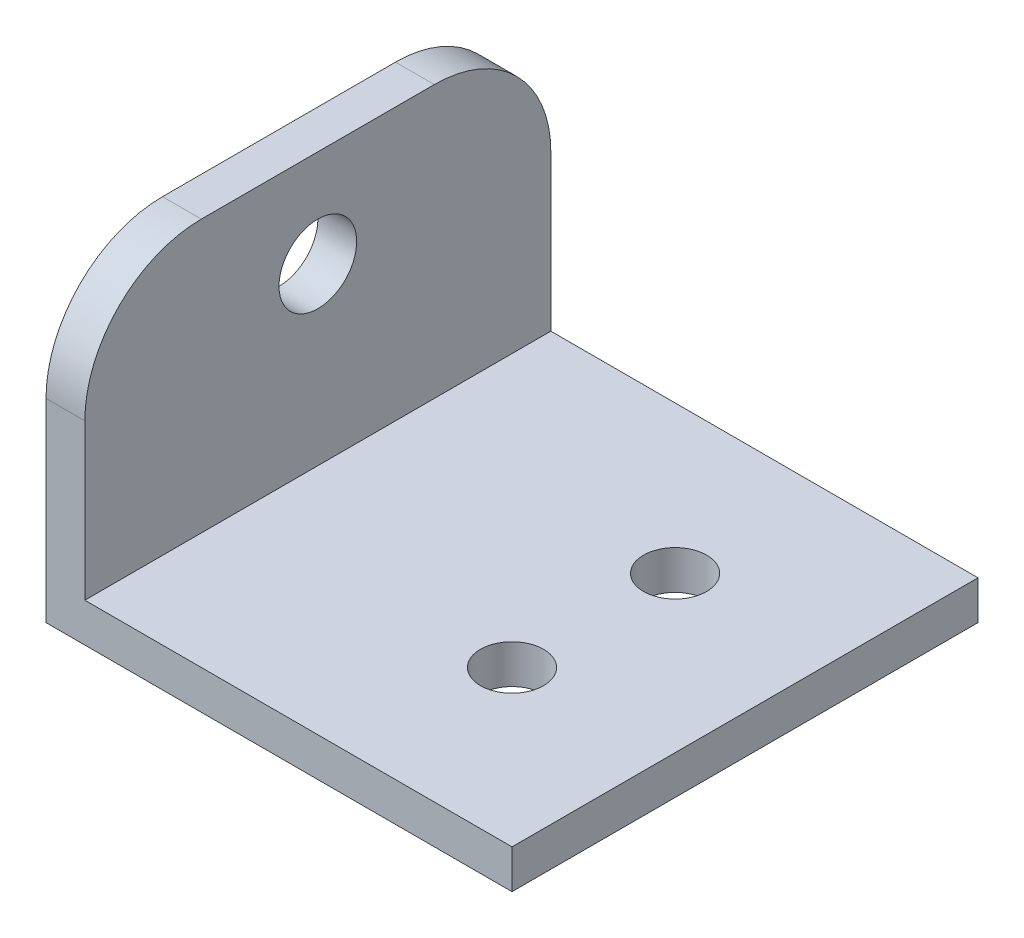
ISO-10303-21;
HEADER;
FILE_DESCRIPTION(('STEP AP214'),'2;1');
FILE_NAME('part.step','',(''),(''),'','','');
FILE_SCHEMA(('AUTOMOTIVE_DESIGN { 1 0 10303 214 1 1 1 1 }'));
ENDSEC;
DATA;
#1=APPLICATION_CONTEXT('core data for automotive mechanical design processes');
#2=APPLICATION_PROTOCOL_DEFINITION('international standard','automotive_design',2000,#1);
#3=PRODUCT_CONTEXT('',#1,'mechanical');
#4=PRODUCT('Part','Part','',(#3));
#5=PRODUCT_RELATED_PRODUCT_CATEGORY('part','',(#4));
#6=PRODUCT_DEFINITION_FORMATION('','',#4);
#7=PRODUCT_DEFINITION_CONTEXT('part definition',#1,'design');
#8=PRODUCT_DEFINITION('design','',#6,#7);
#9=PRODUCT_DEFINITION_SHAPE('','',#8);
#10=(LENGTH_UNIT() NAMED_UNIT(*) SI_UNIT(.MILLI.,.METRE.));
#11=(NAMED_UNIT(*) PLANE_ANGLE_UNIT() SI_UNIT($,.RADIAN.));
#12=(NAMED_UNIT(*) SI_UNIT($,.STERADIAN.) SOLID_ANGLE_UNIT());
#13=UNCERTAINTY_MEASURE_WITH_UNIT(LENGTH_MEASURE(1.E-05),#10,'distance_accuracy_value','');
#14=(GEOMETRIC_REPRESENTATION_CONTEXT(3) GLOBAL_UNCERTAINTY_ASSIGNED_CONTEXT((#13)) GLOBAL_UNIT_ASSIGNED_CONTEXT((#10,
#11,#12)) REPRESENTATION_CONTEXT('',''));
#15=CARTESIAN_POINT('',(0.,0.,0.));
#16=DIRECTION('',(0.,0.,1.));
#17=DIRECTION('',(1.,0.,0.));
#18=AXIS2_PLACEMENT_3D('',#15,#16,#17);
#19=CARTESIAN_POINT('',(0.,0.,38.1));
#20=DIRECTION('',(0.,1.,0.));
#21=DIRECTION('',(0.,0.,1.));
#22=AXIS2_PLACEMENT_3D('',#19,#20,#21);
#23=PLANE('',#22);
#24=CARTESIAN_POINT('',(25.4,0.,25.4));
#25=DIRECTION('',(0.,-1.,0.));
#26=DIRECTION('',(0.,0.,-1.));
#27=AXIS2_PLACEMENT_3D('',#24,#25,#26);
#28=CIRCLE('',#27,2.57968749999999);
#29=CARTESIAN_POINT('',(25.4,0.,22.8203125));
#30=VERTEX_POINT('',#29);
#31=EDGE_CURVE('E189',#30,#30,#28,.T.);
#32=ORIENTED_EDGE('',*,*,#31,.F.);
#33=EDGE_LOOP('',(#32));
#34=FACE_BOUND('',#33,.T.);
#35=CARTESIAN_POINT('',(25.4,0.,12.065));
#36=DIRECTION('',(0.,-1.,0.));
#37=DIRECTION('',(0.,0.,-1.));
#38=AXIS2_PLACEMENT_3D('',#35,#36,#37);
#39=CIRCLE('',#38,2.57968749999999);
#40=CARTESIAN_POINT('',(25.4,0.,9.48531250000001));
#41=VERTEX_POINT('',#40);
#42=EDGE_CURVE('E183',#41,#41,#39,.T.);
#43=ORIENTED_EDGE('',*,*,#42,.F.);
#44=EDGE_LOOP('',(#43));
#45=FACE_BOUND('',#44,.T.);
#46=DIRECTION('',(1.,0.,0.));
#47=VECTOR('',#46,1.);
#48=CARTESIAN_POINT('',(0.,0.,0.));
#49=LINE('',#48,#47);
#50=CARTESIAN_POINT('',(0.,0.,0.));
#51=VERTEX_POINT('',#50);
#52=CARTESIAN_POINT('',(38.1,0.,0.));
#53=VERTEX_POINT('',#52);
#54=EDGE_CURVE('E127',#51,#53,#49,.T.);
#55=ORIENTED_EDGE('',*,*,#54,.T.);
#56=DIRECTION('',(0.,0.,-1.));
#57=VECTOR('',#56,1.);
#58=CARTESIAN_POINT('',(38.1,0.,38.1));
#59=LINE('',#58,#57);
#60=CARTESIAN_POINT('',(38.1,0.,38.1));
#61=VERTEX_POINT('',#60);
#62=EDGE_CURVE('E108',#61,#53,#59,.T.);
#63=ORIENTED_EDGE('',*,*,#62,.F.);
#64=DIRECTION('',(1.,0.,0.));
#65=VECTOR('',#64,1.);
#66=CARTESIAN_POINT('',(0.,0.,38.1));
#67=LINE('',#66,#65);
#68=CARTESIAN_POINT('',(0.,0.,38.1));
#69=VERTEX_POINT('',#68);
#70=EDGE_CURVE('E115',#69,#61,#67,.T.);
#71=ORIENTED_EDGE('',*,*,#70,.F.);
#72=DIRECTION('',(0.,0.,-1.));
#73=VECTOR('',#72,1.);
#74=CARTESIAN_POINT('',(0.,0.,38.1));
#75=LINE('',#74,#73);
#76=EDGE_CURVE('E167',#69,#51,#75,.T.);
#77=ORIENTED_EDGE('',*,*,#76,.T.);
#78=EDGE_LOOP('',(#55,#63,#71,#77));
#79=FACE_BOUND('',#78,.T.);
#80=ADVANCED_FACE('F35',(#34,#45,#79),#23,.F.);
#81=CARTESIAN_POINT('',(38.1,0.,38.1));
#82=DIRECTION('',(-1.,0.,0.));
#83=DIRECTION('',(0.,0.,1.));
#84=AXIS2_PLACEMENT_3D('',#81,#82,#83);
#85=PLANE('',#84);
#86=DIRECTION('',(0.,1.,0.));
#87=VECTOR('',#86,1.);
#88=CARTESIAN_POINT('',(38.1,0.,0.));
#89=LINE('',#88,#87);
#90=CARTESIAN_POINT('',(38.1,3.175,0.));
#91=VERTEX_POINT('',#90);
#92=EDGE_CURVE('E173',#53,#91,#89,.T.);
#93=ORIENTED_EDGE('',*,*,#92,.T.);
#94=DIRECTION('',(0.,0.,-1.));
#95=VECTOR('',#94,1.);
#96=CARTESIAN_POINT('',(38.1,3.175,38.1));
#97=LINE('',#96,#95);
#98=CARTESIAN_POINT('',(38.1,3.175,38.1));
#99=VERTEX_POINT('',#98);
#100=EDGE_CURVE('E111',#99,#91,#97,.T.);
#101=ORIENTED_EDGE('',*,*,#100,.F.);
#102=DIRECTION('',(0.,1.,0.));
#103=VECTOR('',#102,1.);
#104=CARTESIAN_POINT('',(38.1,0.,38.1));
#105=LINE('',#104,#103);
#106=EDGE_CURVE('E104',#61,#99,#105,.T.);
#107=ORIENTED_EDGE('',*,*,#106,.F.);
#108=ORIENTED_EDGE('',*,*,#62,.T.);
#109=EDGE_LOOP('',(#93,#101,#107,#108));
#110=FACE_BOUND('',#109,.T.);
#111=ADVANCED_FACE('F106',(#110),#85,.F.);
#112=CARTESIAN_POINT('',(3.175,3.175,38.1));
#113=DIRECTION('',(0.,-1.,0.));
#114=DIRECTION('',(0.,0.,-1.));
#115=AXIS2_PLACEMENT_3D('',#112,#113,#114);
#116=PLANE('',#115);
#117=CARTESIAN_POINT('',(25.4,3.175,25.4));
#118=DIRECTION('',(0.,-1.,0.));
#119=DIRECTION('',(0.,0.,-1.));
#120=AXIS2_PLACEMENT_3D('',#117,#118,#119);
#121=CIRCLE('',#120,2.57968749999999);
#122=CARTESIAN_POINT('',(25.4,3.175,22.8203125));
#123=VERTEX_POINT('',#122);
#124=EDGE_CURVE('E186',#123,#123,#121,.T.);
#125=ORIENTED_EDGE('',*,*,#124,.T.);
#126=EDGE_LOOP('',(#125));
#127=FACE_BOUND('',#126,.T.);
#128=CARTESIAN_POINT('',(25.4,3.175,12.065));
#129=DIRECTION('',(0.,-1.,0.));
#130=DIRECTION('',(0.,0.,-1.));
#131=AXIS2_PLACEMENT_3D('',#128,#129,#130);
#132=CIRCLE('',#131,2.57968749999999);
#133=CARTESIAN_POINT('',(25.4,3.175,9.48531250000001));
#134=VERTEX_POINT('',#133);
#135=EDGE_CURVE('E177',#134,#134,#132,.T.);
#136=ORIENTED_EDGE('',*,*,#135,.T.);
#137=EDGE_LOOP('',(#136));
#138=FACE_BOUND('',#137,.T.);
#139=DIRECTION('',(-1.,0.,0.));
#140=VECTOR('',#139,1.);
#141=CARTESIAN_POINT('',(3.175,3.175,0.));
#142=LINE('',#141,#140);
#143=CARTESIAN_POINT('',(3.175,3.175,0.));
#144=VERTEX_POINT('',#143);
#145=EDGE_CURVE('E163',#91,#144,#142,.T.);
#146=ORIENTED_EDGE('',*,*,#145,.T.);
#147=DIRECTION('',(0.,0.,-1.));
#148=VECTOR('',#147,1.);
#149=CARTESIAN_POINT('',(3.175,3.175,38.1));
#150=LINE('',#149,#148);
#151=CARTESIAN_POINT('',(3.175,3.175,38.1));
#152=VERTEX_POINT('',#151);
#153=EDGE_CURVE('E132',#152,#144,#150,.T.);
#154=ORIENTED_EDGE('',*,*,#153,.F.);
#155=DIRECTION('',(-1.,0.,0.));
#156=VECTOR('',#155,1.);
#157=CARTESIAN_POINT('',(3.175,3.175,38.1));
#158=LINE('',#157,#156);
#159=EDGE_CURVE('E114',#99,#152,#158,.T.);
#160=ORIENTED_EDGE('',*,*,#159,.F.);
#161=ORIENTED_EDGE('',*,*,#100,.T.);
#162=EDGE_LOOP('',(#146,#154,#160,#161));
#163=FACE_BOUND('',#162,.T.);
#164=ADVANCED_FACE('F217',(#127,#138,#163),#116,.F.);
#165=CARTESIAN_POINT('',(3.175,3.175,38.1));
#166=DIRECTION('',(-1.,0.,0.));
#167=DIRECTION('',(0.,0.,1.));
#168=AXIS2_PLACEMENT_3D('',#165,#166,#167);
#169=PLANE('',#168);
#170=CARTESIAN_POINT('',(3.175,17.4625,19.05));
#171=DIRECTION('',(-1.,0.,0.));
#172=DIRECTION('',(0.,0.,1.));
#173=AXIS2_PLACEMENT_3D('',#170,#171,#172);
#174=CIRCLE('',#173,3.17499999999999);
#175=CARTESIAN_POINT('',(3.175,17.4625,22.225));
#176=VERTEX_POINT('',#175);
#177=EDGE_CURVE('E192',#176,#176,#174,.T.);
#178=ORIENTED_EDGE('',*,*,#177,.T.);
#179=EDGE_LOOP('',(#178));
#180=FACE_BOUND('',#179,.T.);
#181=DIRECTION('',(0.,1.,0.));
#182=VECTOR('',#181,1.);
#183=CARTESIAN_POINT('',(3.175,3.175,0.));
#184=LINE('',#183,#182);
#185=CARTESIAN_POINT('',(3.175,15.875,0.));
#186=VERTEX_POINT('',#185);
#187=EDGE_CURVE('E148',#144,#186,#184,.T.);
#188=ORIENTED_EDGE('',*,*,#187,.T.);
#189=CARTESIAN_POINT('',(3.175,15.875,9.525));
#190=DIRECTION('',(-1.,0.,0.));
#191=DIRECTION('',(0.,0.,1.));
#192=AXIS2_PLACEMENT_3D('',#189,#190,#191);
#193=CIRCLE('',#192,9.525);
#194=CARTESIAN_POINT('',(3.175,25.4,9.52500000000001));
#195=VERTEX_POINT('',#194);
#196=EDGE_CURVE('E43',#186,#195,#193,.F.);
#197=ORIENTED_EDGE('',*,*,#196,.T.);
#198=DIRECTION('',(0.,0.,-1.));
#199=VECTOR('',#198,1.);
#200=CARTESIAN_POINT('',(3.175,25.4,38.1));
#201=LINE('',#200,#199);
#202=CARTESIAN_POINT('',(3.175,25.4,28.575));
#203=VERTEX_POINT('',#202);
#204=EDGE_CURVE('E146',#203,#195,#201,.T.);
#205=ORIENTED_EDGE('',*,*,#204,.F.);
#206=CARTESIAN_POINT('',(3.175,15.875,28.575));
#207=DIRECTION('',(-1.,0.,0.));
#208=DIRECTION('',(0.,0.,1.));
#209=AXIS2_PLACEMENT_3D('',#206,#207,#208);
#210=CIRCLE('',#209,9.525);
#211=CARTESIAN_POINT('',(3.175,15.875,38.1));
#212=VERTEX_POINT('',#211);
#213=EDGE_CURVE('E50',#203,#212,#210,.F.);
#214=ORIENTED_EDGE('',*,*,#213,.T.);
#215=DIRECTION('',(0.,1.,0.));
#216=VECTOR('',#215,1.);
#217=CARTESIAN_POINT('',(3.175,3.175,38.1));
#218=LINE('',#217,#216);
#219=EDGE_CURVE('E170',#152,#212,#218,.T.);
#220=ORIENTED_EDGE('',*,*,#219,.F.);
#221=ORIENTED_EDGE('',*,*,#153,.T.);
#222=EDGE_LOOP('',(#188,#197,#205,#214,#220,#221));
#223=FACE_BOUND('',#222,.T.);
#224=ADVANCED_FACE('F145',(#180,#223),#169,.F.);
#225=CARTESIAN_POINT('',(0.,25.4,38.1));
#226=DIRECTION('',(0.,-1.,0.));
#227=DIRECTION('',(0.,0.,-1.));
#228=AXIS2_PLACEMENT_3D('',#225,#226,#227);
#229=PLANE('',#228);
#230=ORIENTED_EDGE('',*,*,#204,.T.);
#231=DIRECTION('',(-1.,0.,0.));
#232=VECTOR('',#231,1.);
#233=CARTESIAN_POINT('',(0.,25.4,9.525));
#234=LINE('',#233,#232);
#235=CARTESIAN_POINT('',(0.,25.4,9.52500000000001));
#236=VERTEX_POINT('',#235);
#237=EDGE_CURVE('E130',#195,#236,#234,.T.);
#238=ORIENTED_EDGE('',*,*,#237,.T.);
#239=DIRECTION('',(0.,0.,-1.));
#240=VECTOR('',#239,1.);
#241=CARTESIAN_POINT('',(0.,25.4,38.1));
#242=LINE('',#241,#240);
#243=CARTESIAN_POINT('',(0.,25.4,28.575));
#244=VERTEX_POINT('',#243);
#245=EDGE_CURVE('E156',#244,#236,#242,.T.);
#246=ORIENTED_EDGE('',*,*,#245,.F.);
#247=DIRECTION('',(-1.,0.,0.));
#248=VECTOR('',#247,1.);
#249=CARTESIAN_POINT('',(3.175,25.4,28.575));
#250=LINE('',#249,#248);
#251=EDGE_CURVE('E128',#244,#203,#250,.F.);
#252=ORIENTED_EDGE('',*,*,#251,.T.);
#253=EDGE_LOOP('',(#230,#238,#246,#252));
#254=FACE_BOUND('',#253,.T.);
#255=ADVANCED_FACE('F152',(#254),#229,.F.);
#256=CARTESIAN_POINT('',(0.,0.,38.1));
#257=DIRECTION('',(1.,0.,0.));
#258=DIRECTION('',(0.,0.,-1.));
#259=AXIS2_PLACEMENT_3D('',#256,#257,#258);
#260=PLANE('',#259);
#261=CARTESIAN_POINT('',(0.,17.4625,19.05));
#262=DIRECTION('',(-1.,0.,0.));
#263=DIRECTION('',(0.,0.,1.));
#264=AXIS2_PLACEMENT_3D('',#261,#262,#263);
#265=CIRCLE('',#264,3.17499999999999);
#266=CARTESIAN_POINT('',(0.,17.4625,22.225));
#267=VERTEX_POINT('',#266);
#268=EDGE_CURVE('E195',#267,#267,#265,.T.);
#269=ORIENTED_EDGE('',*,*,#268,.F.);
#270=EDGE_LOOP('',(#269));
#271=FACE_BOUND('',#270,.T.);
#272=ORIENTED_EDGE('',*,*,#245,.T.);
#273=CARTESIAN_POINT('',(0.,15.875,9.525));
#274=DIRECTION('',(1.,0.,0.));
#275=DIRECTION('',(0.,0.,-1.));
#276=AXIS2_PLACEMENT_3D('',#273,#274,#275);
#277=CIRCLE('',#276,9.525);
#278=CARTESIAN_POINT('',(0.,15.875,0.));
#279=VERTEX_POINT('',#278);
#280=EDGE_CURVE('E140',#236,#279,#277,.F.);
#281=ORIENTED_EDGE('',*,*,#280,.T.);
#282=DIRECTION('',(0.,-1.,0.));
#283=VECTOR('',#282,1.);
#284=CARTESIAN_POINT('',(0.,0.,0.));
#285=LINE('',#284,#283);
#286=EDGE_CURVE('E124',#279,#51,#285,.T.);
#287=ORIENTED_EDGE('',*,*,#286,.T.);
#288=ORIENTED_EDGE('',*,*,#76,.F.);
#289=DIRECTION('',(0.,-1.,0.));
#290=VECTOR('',#289,1.);
#291=CARTESIAN_POINT('',(0.,0.,38.1));
#292=LINE('',#291,#290);
#293=CARTESIAN_POINT('',(0.,15.875,38.1));
#294=VERTEX_POINT('',#293);
#295=EDGE_CURVE('E120',#294,#69,#292,.T.);
#296=ORIENTED_EDGE('',*,*,#295,.F.);
#297=CARTESIAN_POINT('',(0.,15.875,28.575));
#298=DIRECTION('',(1.,0.,0.));
#299=DIRECTION('',(0.,0.,-1.));
#300=AXIS2_PLACEMENT_3D('',#297,#298,#299);
#301=CIRCLE('',#300,9.525);
#302=EDGE_CURVE('E138',#294,#244,#301,.F.);
#303=ORIENTED_EDGE('',*,*,#302,.T.);
#304=EDGE_LOOP('',(#272,#281,#287,#288,#296,#303));
#305=FACE_BOUND('',#304,.T.);
#306=ADVANCED_FACE('F160',(#271,#305),#260,.F.);
#307=CARTESIAN_POINT('',(0.,0.,38.1));
#308=DIRECTION('',(0.,0.,1.));
#309=DIRECTION('',(1.,0.,0.));
#310=AXIS2_PLACEMENT_3D('',#307,#308,#309);
#311=PLANE('',#310);
#312=ORIENTED_EDGE('',*,*,#219,.T.);
#313=DIRECTION('',(-1.,0.,0.));
#314=VECTOR('',#313,1.);
#315=CARTESIAN_POINT('',(0.,15.875,38.1));
#316=LINE('',#315,#314);
#317=EDGE_CURVE('E11',#212,#294,#316,.T.);
#318=ORIENTED_EDGE('',*,*,#317,.T.);
#319=ORIENTED_EDGE('',*,*,#295,.T.);
#320=ORIENTED_EDGE('',*,*,#70,.T.);
#321=ORIENTED_EDGE('',*,*,#106,.T.);
#322=ORIENTED_EDGE('',*,*,#159,.T.);
#323=EDGE_LOOP('',(#312,#318,#319,#320,#321,#322));
#324=FACE_BOUND('',#323,.T.);
#325=ADVANCED_FACE('F118',(#324),#311,.T.);
#326=CARTESIAN_POINT('',(0.,0.,0.));
#327=DIRECTION('',(0.,0.,1.));
#328=DIRECTION('',(1.,0.,0.));
#329=AXIS2_PLACEMENT_3D('',#326,#327,#328);
#330=PLANE('',#329);
#331=ORIENTED_EDGE('',*,*,#286,.F.);
#332=DIRECTION('',(-1.,0.,0.));
#333=VECTOR('',#332,1.);
#334=CARTESIAN_POINT('',(0.,15.875,0.));
#335=LINE('',#334,#333);
#336=EDGE_CURVE('E58',#279,#186,#335,.F.);
#337=ORIENTED_EDGE('',*,*,#336,.T.);
#338=ORIENTED_EDGE('',*,*,#187,.F.);
#339=ORIENTED_EDGE('',*,*,#145,.F.);
#340=ORIENTED_EDGE('',*,*,#92,.F.);
#341=ORIENTED_EDGE('',*,*,#54,.F.);
#342=EDGE_LOOP('',(#331,#337,#338,#339,#340,#341));
#343=FACE_BOUND('',#342,.T.);
#344=ADVANCED_FACE('F161',(#343),#330,.F.);
#345=CARTESIAN_POINT('',(25.4,0.,12.065));
#346=DIRECTION('',(0.,-1.,0.));
#347=DIRECTION('',(0.,0.,-1.));
#348=AXIS2_PLACEMENT_3D('',#345,#346,#347);
#349=CYLINDRICAL_SURFACE('',#348,2.57968749999999);
#350=ORIENTED_EDGE('',*,*,#42,.T.);
#351=EDGE_LOOP('',(#350));
#352=FACE_BOUND('',#351,.T.);
#353=ORIENTED_EDGE('',*,*,#135,.F.);
#354=EDGE_LOOP('',(#353));
#355=FACE_BOUND('',#354,.T.);
#356=ADVANCED_FACE('F233',(#352,#355),#349,.F.);
#357=CARTESIAN_POINT('',(25.4,0.,25.4));
#358=DIRECTION('',(0.,-1.,0.));
#359=DIRECTION('',(0.,0.,-1.));
#360=AXIS2_PLACEMENT_3D('',#357,#358,#359);
#361=CYLINDRICAL_SURFACE('',#360,2.57968749999999);
#362=ORIENTED_EDGE('',*,*,#31,.T.);
#363=EDGE_LOOP('',(#362));
#364=FACE_BOUND('',#363,.T.);
#365=ORIENTED_EDGE('',*,*,#124,.F.);
#366=EDGE_LOOP('',(#365));
#367=FACE_BOUND('',#366,.T.);
#368=ADVANCED_FACE('F228',(#364,#367),#361,.F.);
#369=CARTESIAN_POINT('',(0.,17.4625,19.05));
#370=DIRECTION('',(-1.,0.,0.));
#371=DIRECTION('',(0.,0.,1.));
#372=AXIS2_PLACEMENT_3D('',#369,#370,#371);
#373=CYLINDRICAL_SURFACE('',#372,3.17499999999999);
#374=ORIENTED_EDGE('',*,*,#268,.T.);
#375=EDGE_LOOP('',(#374));
#376=FACE_BOUND('',#375,.T.);
#377=ORIENTED_EDGE('',*,*,#177,.F.);
#378=EDGE_LOOP('',(#377));
#379=FACE_BOUND('',#378,.T.);
#380=ADVANCED_FACE('F199',(#376,#379),#373,.F.);
#381=CARTESIAN_POINT('',(0.,15.875,9.525));
#382=DIRECTION('',(-1.,0.,0.));
#383=DIRECTION('',(0.,0.,1.));
#384=AXIS2_PLACEMENT_3D('',#381,#382,#383);
#385=CYLINDRICAL_SURFACE('',#384,9.525);
#386=ORIENTED_EDGE('',*,*,#196,.F.);
#387=ORIENTED_EDGE('',*,*,#336,.F.);
#388=ORIENTED_EDGE('',*,*,#280,.F.);
#389=ORIENTED_EDGE('',*,*,#237,.F.);
#390=EDGE_LOOP('',(#386,#387,#388,#389));
#391=FACE_BOUND('',#390,.T.);
#392=ADVANCED_FACE('F158',(#391),#385,.T.);
#393=CARTESIAN_POINT('',(0.,15.875,28.575));
#394=DIRECTION('',(1.,0.,0.));
#395=DIRECTION('',(0.,0.,-1.));
#396=AXIS2_PLACEMENT_3D('',#393,#394,#395);
#397=CYLINDRICAL_SURFACE('',#396,9.525);
#398=ORIENTED_EDGE('',*,*,#213,.F.);
#399=ORIENTED_EDGE('',*,*,#251,.F.);
#400=ORIENTED_EDGE('',*,*,#302,.F.);
#401=ORIENTED_EDGE('',*,*,#317,.F.);
#402=EDGE_LOOP('',(#398,#399,#400,#401));
#403=FACE_BOUND('',#402,.T.);
#404=ADVANCED_FACE('F37',(#403),#397,.T.);
#405=CLOSED_SHELL('',(#80,#111,#164,#224,#255,#306,#325,#344,#356,#368,#380,#392,#404));
#406=MANIFOLD_SOLID_BREP('B2',#405);
#407=ADVANCED_BREP_SHAPE_REPRESENTATION('',(#18,#406),#14);
#408=SHAPE_DEFINITION_REPRESENTATION(#9,#407);
ENDSEC;
END-ISO-10303-21;
